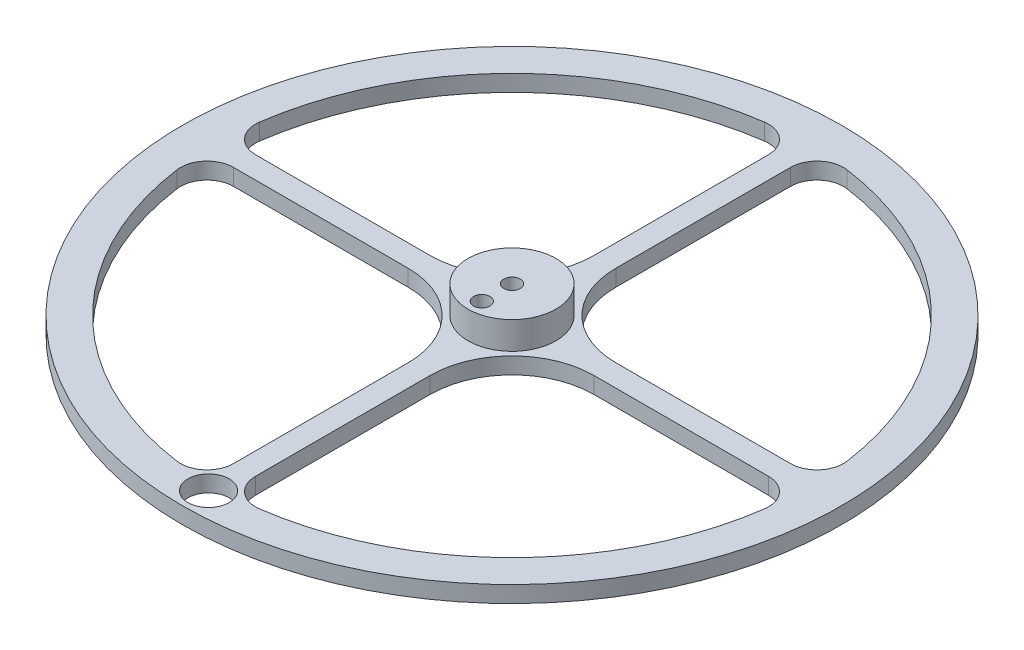
ISO-10303-21;
HEADER;
FILE_DESCRIPTION(('STEP AP214'),'2;1');
FILE_NAME('part.step','',(''),(''),'','','');
FILE_SCHEMA(('AUTOMOTIVE_DESIGN { 1 0 10303 214 1 1 1 1 }'));
ENDSEC;
DATA;
#1=APPLICATION_CONTEXT('core data for automotive mechanical design processes');
#2=APPLICATION_PROTOCOL_DEFINITION('international standard','automotive_design',2000,#1);
#3=PRODUCT_CONTEXT('',#1,'mechanical');
#4=PRODUCT('Part','Part','',(#3));
#5=PRODUCT_RELATED_PRODUCT_CATEGORY('part','',(#4));
#6=PRODUCT_DEFINITION_FORMATION('','',#4);
#7=PRODUCT_DEFINITION_CONTEXT('part definition',#1,'design');
#8=PRODUCT_DEFINITION('design','',#6,#7);
#9=PRODUCT_DEFINITION_SHAPE('','',#8);
#10=(LENGTH_UNIT() NAMED_UNIT(*) SI_UNIT(.MILLI.,.METRE.));
#11=(NAMED_UNIT(*) PLANE_ANGLE_UNIT() SI_UNIT($,.RADIAN.));
#12=(NAMED_UNIT(*) SI_UNIT($,.STERADIAN.) SOLID_ANGLE_UNIT());
#13=UNCERTAINTY_MEASURE_WITH_UNIT(LENGTH_MEASURE(1.E-05),#10,'distance_accuracy_value','');
#14=(GEOMETRIC_REPRESENTATION_CONTEXT(3) GLOBAL_UNCERTAINTY_ASSIGNED_CONTEXT((#13)) GLOBAL_UNIT_ASSIGNED_CONTEXT((#10,
#11,#12)) REPRESENTATION_CONTEXT('',''));
#15=CARTESIAN_POINT('',(0.,0.,0.));
#16=DIRECTION('',(0.,0.,1.));
#17=DIRECTION('',(1.,0.,0.));
#18=AXIS2_PLACEMENT_3D('',#15,#16,#17);
#19=CARTESIAN_POINT('',(0.,0.,0.));
#20=DIRECTION('',(0.,1.,0.));
#21=DIRECTION('',(0.,0.,1.));
#22=AXIS2_PLACEMENT_3D('',#19,#20,#21);
#23=PLANE('',#22);
#24=CARTESIAN_POINT('',(0.,0.,55.25));
#25=DIRECTION('',(0.,1.,0.));
#26=DIRECTION('',(0.,0.,1.));
#27=AXIS2_PLACEMENT_3D('',#24,#25,#26);
#28=CIRCLE('',#27,3.75);
#29=CARTESIAN_POINT('',(0.,0.,59.));
#30=VERTEX_POINT('',#29);
#31=EDGE_CURVE('E743',#30,#30,#28,.T.);
#32=ORIENTED_EDGE('',*,*,#31,.F.);
#33=EDGE_LOOP('',(#32));
#34=FACE_BOUND('',#33,.T.);
#35=CARTESIAN_POINT('',(0.,0.,0.));
#36=DIRECTION('',(0.,1.,0.));
#37=DIRECTION('',(0.,0.,1.));
#38=AXIS2_PLACEMENT_3D('',#35,#36,#37);
#39=CIRCLE('',#38,60.);
#40=CARTESIAN_POINT('',(0.,0.,60.));
#41=VERTEX_POINT('',#40);
#42=EDGE_CURVE('E240',#41,#41,#39,.T.);
#43=ORIENTED_EDGE('',*,*,#42,.T.);
#44=EDGE_LOOP('',(#43));
#45=FACE_BOUND('',#44,.T.);
#46=CARTESIAN_POINT('',(16.8994944431473,0.,16.8994944431475));
#47=DIRECTION('',(0.,1.,0.));
#48=DIRECTION('',(0.,0.,1.));
#49=AXIS2_PLACEMENT_3D('',#46,#47,#48);
#50=CIRCLE('',#49,14.8994942387478);
#51=CARTESIAN_POINT('',(16.8994944431474,0.,2.00000020439968));
#52=VERTEX_POINT('',#51);
#53=CARTESIAN_POINT('',(2.00000020439951,0.,16.8994944431475));
#54=VERTEX_POINT('',#53);
#55=EDGE_CURVE('E342',#52,#54,#50,.T.);
#56=ORIENTED_EDGE('',*,*,#55,.F.);
#57=DIRECTION('',(1.,0.,0.));
#58=VECTOR('',#57,1.);
#59=CARTESIAN_POINT('',(0.,0.,2.00000020439951));
#60=LINE('',#59,#58);
#61=CARTESIAN_POINT('',(48.6941677054723,0.,2.00000020440002));
#62=VERTEX_POINT('',#61);
#63=EDGE_CURVE('E344',#52,#62,#60,.T.);
#64=ORIENTED_EDGE('',*,*,#63,.T.);
#65=CARTESIAN_POINT('',(48.6941677054722,0.,6.82926831761021));
#66=DIRECTION('',(0.,1.,0.));
#67=DIRECTION('',(0.,0.,1.));
#68=AXIS2_PLACEMENT_3D('',#65,#66,#67);
#69=CIRCLE('',#68,4.82926811321019);
#70=CARTESIAN_POINT('',(53.4766304099276,0.,7.50000000000056));
#71=VERTEX_POINT('',#70);
#72=EDGE_CURVE('E347',#62,#71,#69,.F.);
#73=ORIENTED_EDGE('',*,*,#72,.T.);
#74=CARTESIAN_POINT('',(0.,0.,0.));
#75=DIRECTION('',(0.,1.,0.));
#76=DIRECTION('',(0.,0.,1.));
#77=AXIS2_PLACEMENT_3D('',#74,#75,#76);
#78=CIRCLE('',#77,54.);
#79=CARTESIAN_POINT('',(7.5,0.,53.4766304099277));
#80=VERTEX_POINT('',#79);
#81=EDGE_CURVE('E298',#80,#71,#78,.T.);
#82=ORIENTED_EDGE('',*,*,#81,.F.);
#83=CARTESIAN_POINT('',(6.8292683176097,0.,48.6941677054723));
#84=DIRECTION('',(0.,1.,0.));
#85=DIRECTION('',(0.,0.,1.));
#86=AXIS2_PLACEMENT_3D('',#83,#84,#85);
#87=CIRCLE('',#86,4.82926811321019);
#88=CARTESIAN_POINT('',(2.00000020439951,0.,48.6941677054723));
#89=VERTEX_POINT('',#88);
#90=EDGE_CURVE('E221',#89,#80,#87,.T.);
#91=ORIENTED_EDGE('',*,*,#90,.F.);
#92=DIRECTION('',(0.,0.,-1.));
#93=VECTOR('',#92,1.);
#94=CARTESIAN_POINT('',(2.00000020439951,0.,0.));
#95=LINE('',#94,#93);
#96=EDGE_CURVE('E246',#89,#54,#95,.T.);
#97=ORIENTED_EDGE('',*,*,#96,.T.);
#98=EDGE_LOOP('',(#56,#64,#73,#82,#91,#97));
#99=FACE_BOUND('',#98,.T.);
#100=CARTESIAN_POINT('',(53.4766304099277,0.,-7.49999999999944));
#101=VERTEX_POINT('',#100);
#102=CARTESIAN_POINT('',(7.50000000000037,0.,-53.4766304099276));
#103=VERTEX_POINT('',#102);
#104=EDGE_CURVE('E327',#101,#103,#78,.T.);
#105=ORIENTED_EDGE('',*,*,#104,.F.);
#106=CARTESIAN_POINT('',(48.6941677054724,0.,-6.82926831760919));
#107=DIRECTION('',(0.,1.,0.));
#108=DIRECTION('',(0.,0.,1.));
#109=AXIS2_PLACEMENT_3D('',#106,#107,#108);
#110=CIRCLE('',#109,4.82926811321019);
#111=CARTESIAN_POINT('',(48.6941677054723,0.,-2.000000204399));
#112=VERTEX_POINT('',#111);
#113=EDGE_CURVE('E328',#112,#101,#110,.T.);
#114=ORIENTED_EDGE('',*,*,#113,.F.);
#115=DIRECTION('',(-1.,0.,0.));
#116=VECTOR('',#115,1.);
#117=CARTESIAN_POINT('',(0.,0.,-2.00000020439951));
#118=LINE('',#117,#116);
#119=CARTESIAN_POINT('',(16.8994944431475,0.,-2.00000020439933));
#120=VERTEX_POINT('',#119);
#121=EDGE_CURVE('E330',#112,#120,#118,.T.);
#122=ORIENTED_EDGE('',*,*,#121,.T.);
#123=CARTESIAN_POINT('',(16.8994944431476,0.,-16.8994944431471));
#124=DIRECTION('',(0.,1.,0.));
#125=DIRECTION('',(0.,0.,1.));
#126=AXIS2_PLACEMENT_3D('',#123,#124,#125);
#127=CIRCLE('',#126,14.8994942387478);
#128=CARTESIAN_POINT('',(2.00000020439962,0.,-16.8994944431474));
#129=VERTEX_POINT('',#128);
#130=EDGE_CURVE('E333',#129,#120,#127,.T.);
#131=ORIENTED_EDGE('',*,*,#130,.F.);
#132=DIRECTION('',(0.,0.,-1.));
#133=VECTOR('',#132,1.);
#134=CARTESIAN_POINT('',(2.0000002043995,0.,0.));
#135=LINE('',#134,#133);
#136=CARTESIAN_POINT('',(2.00000020439984,0.,-48.6941677054723));
#137=VERTEX_POINT('',#136);
#138=EDGE_CURVE('E336',#129,#137,#135,.T.);
#139=ORIENTED_EDGE('',*,*,#138,.T.);
#140=CARTESIAN_POINT('',(6.82926831761003,0.,-48.6941677054722));
#141=DIRECTION('',(0.,1.,0.));
#142=DIRECTION('',(0.,0.,1.));
#143=AXIS2_PLACEMENT_3D('',#140,#141,#142);
#144=CIRCLE('',#143,4.82926811321019);
#145=EDGE_CURVE('E339',#137,#103,#144,.F.);
#146=ORIENTED_EDGE('',*,*,#145,.T.);
#147=EDGE_LOOP('',(#105,#114,#122,#131,#139,#146));
#148=FACE_BOUND('',#147,.T.);
#149=CARTESIAN_POINT('',(-7.49999999999963,0.,-53.4766304099277));
#150=VERTEX_POINT('',#149);
#151=CARTESIAN_POINT('',(-53.4766304099276,0.,-7.50000000000019));
#152=VERTEX_POINT('',#151);
#153=EDGE_CURVE('E299',#150,#152,#78,.T.);
#154=ORIENTED_EDGE('',*,*,#153,.F.);
#155=CARTESIAN_POINT('',(-6.82926831760936,0.,-48.6941677054723));
#156=DIRECTION('',(0.,1.,0.));
#157=DIRECTION('',(0.,0.,1.));
#158=AXIS2_PLACEMENT_3D('',#155,#156,#157);
#159=CIRCLE('',#158,4.82926811321019);
#160=CARTESIAN_POINT('',(-2.00000020439917,0.,-48.6941677054723));
#161=VERTEX_POINT('',#160);
#162=EDGE_CURVE('E313',#161,#150,#159,.T.);
#163=ORIENTED_EDGE('',*,*,#162,.F.);
#164=DIRECTION('',(0.,0.,1.));
#165=VECTOR('',#164,1.);
#166=CARTESIAN_POINT('',(-2.00000020439951,0.,0.));
#167=LINE('',#166,#165);
#168=CARTESIAN_POINT('',(-2.00000020439939,0.,-16.8994944431475));
#169=VERTEX_POINT('',#168);
#170=EDGE_CURVE('E315',#161,#169,#167,.T.);
#171=ORIENTED_EDGE('',*,*,#170,.T.);
#172=CARTESIAN_POINT('',(-16.8994944431471,0.,-16.8994944431476));
#173=DIRECTION('',(0.,1.,0.));
#174=DIRECTION('',(0.,0.,1.));
#175=AXIS2_PLACEMENT_3D('',#172,#173,#174);
#176=CIRCLE('',#175,14.8994942387478);
#177=CARTESIAN_POINT('',(-16.8994944431475,0.,-2.00000020439957));
#178=VERTEX_POINT('',#177);
#179=EDGE_CURVE('E318',#178,#169,#176,.T.);
#180=ORIENTED_EDGE('',*,*,#179,.F.);
#181=DIRECTION('',(-1.,0.,0.));
#182=VECTOR('',#181,1.);
#183=CARTESIAN_POINT('',(0.,0.,-2.00000020439951));
#184=LINE('',#183,#182);
#185=CARTESIAN_POINT('',(-48.6941677054723,0.,-2.00000020439968));
#186=VERTEX_POINT('',#185);
#187=EDGE_CURVE('E321',#178,#186,#184,.T.);
#188=ORIENTED_EDGE('',*,*,#187,.T.);
#189=CARTESIAN_POINT('',(-48.6941677054723,0.,-6.82926831760987));
#190=DIRECTION('',(0.,1.,0.));
#191=DIRECTION('',(0.,0.,1.));
#192=AXIS2_PLACEMENT_3D('',#189,#190,#191);
#193=CIRCLE('',#192,4.82926811321019);
#194=EDGE_CURVE('E324',#186,#152,#193,.F.);
#195=ORIENTED_EDGE('',*,*,#194,.T.);
#196=EDGE_LOOP('',(#154,#163,#171,#180,#188,#195));
#197=FACE_BOUND('',#196,.T.);
#198=CARTESIAN_POINT('',(-53.4766304099277,0.,7.49999999999981));
#199=VERTEX_POINT('',#198);
#200=CARTESIAN_POINT('',(-7.5,0.,53.4766304099277));
#201=VERTEX_POINT('',#200);
#202=EDGE_CURVE('E293',#199,#201,#78,.T.);
#203=ORIENTED_EDGE('',*,*,#202,.F.);
#204=CARTESIAN_POINT('',(-48.6941677054723,0.,6.82926831760953));
#205=DIRECTION('',(0.,1.,0.));
#206=DIRECTION('',(0.,0.,1.));
#207=AXIS2_PLACEMENT_3D('',#204,#205,#206);
#208=CIRCLE('',#207,4.8292681132102);
#209=CARTESIAN_POINT('',(-48.6941677054723,0.,2.00000020439934));
#210=VERTEX_POINT('',#209);
#211=EDGE_CURVE('E296',#210,#199,#208,.T.);
#212=ORIENTED_EDGE('',*,*,#211,.F.);
#213=DIRECTION('',(1.,0.,0.));
#214=VECTOR('',#213,1.);
#215=CARTESIAN_POINT('',(0.,0.,2.00000020439951));
#216=LINE('',#215,#214);
#217=CARTESIAN_POINT('',(-16.8994944431475,0.,2.00000020439945));
#218=VERTEX_POINT('',#217);
#219=EDGE_CURVE('E301',#210,#218,#216,.T.);
#220=ORIENTED_EDGE('',*,*,#219,.T.);
#221=CARTESIAN_POINT('',(-16.8994944431472,0.,16.8994944431475));
#222=DIRECTION('',(0.,1.,0.));
#223=DIRECTION('',(0.,0.,1.));
#224=AXIS2_PLACEMENT_3D('',#221,#222,#223);
#225=CIRCLE('',#224,14.8994942387477);
#226=CARTESIAN_POINT('',(-2.00000020439951,0.,16.8994944431475));
#227=VERTEX_POINT('',#226);
#228=EDGE_CURVE('E304',#227,#218,#225,.T.);
#229=ORIENTED_EDGE('',*,*,#228,.F.);
#230=DIRECTION('',(0.,0.,1.));
#231=VECTOR('',#230,1.);
#232=CARTESIAN_POINT('',(-2.00000020439951,0.,0.));
#233=LINE('',#232,#231);
#234=CARTESIAN_POINT('',(-2.00000020439951,0.,48.6941677054723));
#235=VERTEX_POINT('',#234);
#236=EDGE_CURVE('E307',#227,#235,#233,.T.);
#237=ORIENTED_EDGE('',*,*,#236,.T.);
#238=CARTESIAN_POINT('',(-6.8292683176097,0.,48.6941677054723));
#239=DIRECTION('',(0.,1.,0.));
#240=DIRECTION('',(0.,0.,1.));
#241=AXIS2_PLACEMENT_3D('',#238,#239,#240);
#242=CIRCLE('',#241,4.82926811321019);
#243=EDGE_CURVE('E310',#235,#201,#242,.F.);
#244=ORIENTED_EDGE('',*,*,#243,.T.);
#245=EDGE_LOOP('',(#203,#212,#220,#229,#237,#244));
#246=FACE_BOUND('',#245,.T.);
#247=CARTESIAN_POINT('',(0.,0.,0.));
#248=DIRECTION('',(0.,1.,0.));
#249=DIRECTION('',(0.,0.,1.));
#250=AXIS2_PLACEMENT_3D('',#247,#248,#249);
#251=CIRCLE('',#250,8.);
#252=CARTESIAN_POINT('',(0.,0.,8.));
#253=VERTEX_POINT('',#252);
#254=EDGE_CURVE('E760',#253,#253,#251,.T.);
#255=ORIENTED_EDGE('',*,*,#254,.F.);
#256=EDGE_LOOP('',(#255));
#257=FACE_BOUND('',#256,.T.);
#258=ADVANCED_FACE('F39',(#34,#45,#99,#148,#197,#246,#257),#23,.T.);
#259=CARTESIAN_POINT('',(16.8994944431473,-3.,16.8994944431475));
#260=DIRECTION('',(0.,1.,0.));
#261=DIRECTION('',(0.,0.,1.));
#262=AXIS2_PLACEMENT_3D('',#259,#260,#261);
#263=CYLINDRICAL_SURFACE('',#262,14.8994942387478);
#264=ORIENTED_EDGE('',*,*,#55,.T.);
#265=DIRECTION('',(0.,1.,0.));
#266=VECTOR('',#265,1.);
#267=CARTESIAN_POINT('',(2.00000020439951,-3.,16.8994944431475));
#268=LINE('',#267,#266);
#269=CARTESIAN_POINT('',(2.00000020439951,-3.,16.8994944431475));
#270=VERTEX_POINT('',#269);
#271=EDGE_CURVE('E11',#270,#54,#268,.T.);
#272=ORIENTED_EDGE('',*,*,#271,.F.);
#273=CARTESIAN_POINT('',(16.8994944431473,-3.,16.8994944431475));
#274=DIRECTION('',(0.,1.,0.));
#275=DIRECTION('',(0.,0.,1.));
#276=AXIS2_PLACEMENT_3D('',#273,#274,#275);
#277=CIRCLE('',#276,14.8994942387478);
#278=CARTESIAN_POINT('',(16.8994944431474,-3.,2.00000020439968));
#279=VERTEX_POINT('',#278);
#280=EDGE_CURVE('E58',#279,#270,#277,.T.);
#281=ORIENTED_EDGE('',*,*,#280,.F.);
#282=DIRECTION('',(0.,1.,0.));
#283=VECTOR('',#282,1.);
#284=CARTESIAN_POINT('',(16.8994944431474,-3.,2.00000020439968));
#285=LINE('',#284,#283);
#286=EDGE_CURVE('E357',#279,#52,#285,.T.);
#287=ORIENTED_EDGE('',*,*,#286,.T.);
#288=EDGE_LOOP('',(#264,#272,#281,#287));
#289=FACE_BOUND('',#288,.T.);
#290=ADVANCED_FACE('F456',(#289),#263,.F.);
#291=CARTESIAN_POINT('',(2.00000020439951,-3.,0.));
#292=DIRECTION('',(1.,0.,0.));
#293=DIRECTION('',(0.,0.,-1.));
#294=AXIS2_PLACEMENT_3D('',#291,#292,#293);
#295=PLANE('',#294);
#296=ORIENTED_EDGE('',*,*,#96,.F.);
#297=DIRECTION('',(0.,1.,0.));
#298=VECTOR('',#297,1.);
#299=CARTESIAN_POINT('',(2.00000020439951,-3.,48.6941677054723));
#300=LINE('',#299,#298);
#301=CARTESIAN_POINT('',(2.00000020439951,-3.,48.6941677054723));
#302=VERTEX_POINT('',#301);
#303=EDGE_CURVE('E49',#302,#89,#300,.T.);
#304=ORIENTED_EDGE('',*,*,#303,.F.);
#305=DIRECTION('',(0.,0.,-1.));
#306=VECTOR('',#305,1.);
#307=CARTESIAN_POINT('',(2.00000020439951,-3.,0.));
#308=LINE('',#307,#306);
#309=EDGE_CURVE('E216',#302,#270,#308,.T.);
#310=ORIENTED_EDGE('',*,*,#309,.T.);
#311=ORIENTED_EDGE('',*,*,#271,.T.);
#312=EDGE_LOOP('',(#296,#304,#310,#311));
#313=FACE_BOUND('',#312,.T.);
#314=ADVANCED_FACE('F457',(#313),#295,.T.);
#315=CARTESIAN_POINT('',(6.8292683176097,-3.,48.6941677054723));
#316=DIRECTION('',(0.,1.,0.));
#317=DIRECTION('',(0.,0.,1.));
#318=AXIS2_PLACEMENT_3D('',#315,#316,#317);
#319=CYLINDRICAL_SURFACE('',#318,4.82926811321019);
#320=ORIENTED_EDGE('',*,*,#90,.T.);
#321=DIRECTION('',(0.,1.,0.));
#322=VECTOR('',#321,1.);
#323=CARTESIAN_POINT('',(7.5,-3.,53.4766304099277));
#324=LINE('',#323,#322);
#325=CARTESIAN_POINT('',(7.5,-3.,53.4766304099277));
#326=VERTEX_POINT('',#325);
#327=EDGE_CURVE('E219',#326,#80,#324,.T.);
#328=ORIENTED_EDGE('',*,*,#327,.F.);
#329=CARTESIAN_POINT('',(6.8292683176097,-3.,48.6941677054723));
#330=DIRECTION('',(0.,1.,0.));
#331=DIRECTION('',(0.,0.,1.));
#332=AXIS2_PLACEMENT_3D('',#329,#330,#331);
#333=CIRCLE('',#332,4.82926811321019);
#334=EDGE_CURVE('E208',#302,#326,#333,.T.);
#335=ORIENTED_EDGE('',*,*,#334,.F.);
#336=ORIENTED_EDGE('',*,*,#303,.T.);
#337=EDGE_LOOP('',(#320,#328,#335,#336));
#338=FACE_BOUND('',#337,.T.);
#339=ADVANCED_FACE('F220',(#338),#319,.F.);
#340=CARTESIAN_POINT('',(0.,-3.,0.));
#341=DIRECTION('',(0.,1.,0.));
#342=DIRECTION('',(0.,0.,1.));
#343=AXIS2_PLACEMENT_3D('',#340,#341,#342);
#344=CYLINDRICAL_SURFACE('',#343,54.);
#345=ORIENTED_EDGE('',*,*,#81,.T.);
#346=DIRECTION('',(0.,1.,0.));
#347=VECTOR('',#346,1.);
#348=CARTESIAN_POINT('',(53.4766304099276,-3.,7.50000000000056));
#349=LINE('',#348,#347);
#350=CARTESIAN_POINT('',(53.4766304099276,-3.,7.50000000000056));
#351=VERTEX_POINT('',#350);
#352=EDGE_CURVE('E225',#351,#71,#349,.T.);
#353=ORIENTED_EDGE('',*,*,#352,.F.);
#354=CARTESIAN_POINT('',(0.,-3.,0.));
#355=DIRECTION('',(0.,1.,0.));
#356=DIRECTION('',(0.,0.,1.));
#357=AXIS2_PLACEMENT_3D('',#354,#355,#356);
#358=CIRCLE('',#357,54.);
#359=EDGE_CURVE('E214',#326,#351,#358,.T.);
#360=ORIENTED_EDGE('',*,*,#359,.F.);
#361=ORIENTED_EDGE('',*,*,#327,.T.);
#362=EDGE_LOOP('',(#345,#353,#360,#361));
#363=FACE_BOUND('',#362,.T.);
#364=ADVANCED_FACE('F227',(#363),#344,.F.);
#365=CARTESIAN_POINT('',(48.6941677054722,-3.,6.82926831761021));
#366=DIRECTION('',(0.,1.,0.));
#367=DIRECTION('',(0.,0.,1.));
#368=AXIS2_PLACEMENT_3D('',#365,#366,#367);
#369=CYLINDRICAL_SURFACE('',#368,4.82926811321019);
#370=ORIENTED_EDGE('',*,*,#72,.F.);
#371=DIRECTION('',(0.,1.,0.));
#372=VECTOR('',#371,1.);
#373=CARTESIAN_POINT('',(48.6941677054723,-3.,2.00000020440002));
#374=LINE('',#373,#372);
#375=CARTESIAN_POINT('',(48.6941677054723,-3.,2.00000020440002));
#376=VERTEX_POINT('',#375);
#377=EDGE_CURVE('E355',#376,#62,#374,.T.);
#378=ORIENTED_EDGE('',*,*,#377,.F.);
#379=CARTESIAN_POINT('',(48.6941677054722,-3.,6.82926831761021));
#380=DIRECTION('',(0.,1.,0.));
#381=DIRECTION('',(0.,0.,1.));
#382=AXIS2_PLACEMENT_3D('',#379,#380,#381);
#383=CIRCLE('',#382,4.82926811321019);
#384=EDGE_CURVE('E229',#376,#351,#383,.F.);
#385=ORIENTED_EDGE('',*,*,#384,.T.);
#386=ORIENTED_EDGE('',*,*,#352,.T.);
#387=EDGE_LOOP('',(#370,#378,#385,#386));
#388=FACE_BOUND('',#387,.T.);
#389=ADVANCED_FACE('F452',(#388),#369,.F.);
#390=ORIENTED_EDGE('',*,*,#104,.T.);
#391=DIRECTION('',(0.,1.,0.));
#392=VECTOR('',#391,1.);
#393=CARTESIAN_POINT('',(7.50000000000037,-3.,-53.4766304099276));
#394=LINE('',#393,#392);
#395=CARTESIAN_POINT('',(7.50000000000037,-3.,-53.4766304099276));
#396=VERTEX_POINT('',#395);
#397=EDGE_CURVE('E359',#396,#103,#394,.T.);
#398=ORIENTED_EDGE('',*,*,#397,.F.);
#399=CARTESIAN_POINT('',(53.4766304099277,-3.,-7.49999999999944));
#400=VERTEX_POINT('',#399);
#401=EDGE_CURVE('E231',#400,#396,#358,.T.);
#402=ORIENTED_EDGE('',*,*,#401,.F.);
#403=DIRECTION('',(0.,1.,0.));
#404=VECTOR('',#403,1.);
#405=CARTESIAN_POINT('',(53.4766304099277,-3.,-7.49999999999944));
#406=LINE('',#405,#404);
#407=EDGE_CURVE('E369',#400,#101,#406,.T.);
#408=ORIENTED_EDGE('',*,*,#407,.T.);
#409=EDGE_LOOP('',(#390,#398,#402,#408));
#410=FACE_BOUND('',#409,.T.);
#411=ADVANCED_FACE('F425',(#410),#344,.F.);
#412=CARTESIAN_POINT('',(6.82926831761003,-3.,-48.6941677054722));
#413=DIRECTION('',(0.,1.,0.));
#414=DIRECTION('',(0.,0.,1.));
#415=AXIS2_PLACEMENT_3D('',#412,#413,#414);
#416=CYLINDRICAL_SURFACE('',#415,4.82926811321019);
#417=ORIENTED_EDGE('',*,*,#145,.F.);
#418=DIRECTION('',(0.,1.,0.));
#419=VECTOR('',#418,1.);
#420=CARTESIAN_POINT('',(2.00000020439984,-3.,-48.6941677054723));
#421=LINE('',#420,#419);
#422=CARTESIAN_POINT('',(2.00000020439984,-3.,-48.6941677054723));
#423=VERTEX_POINT('',#422);
#424=EDGE_CURVE('E361',#423,#137,#421,.T.);
#425=ORIENTED_EDGE('',*,*,#424,.F.);
#426=CARTESIAN_POINT('',(6.82926831761003,-3.,-48.6941677054722));
#427=DIRECTION('',(0.,1.,0.));
#428=DIRECTION('',(0.,0.,1.));
#429=AXIS2_PLACEMENT_3D('',#426,#427,#428);
#430=CIRCLE('',#429,4.82926811321019);
#431=EDGE_CURVE('E283',#423,#396,#430,.F.);
#432=ORIENTED_EDGE('',*,*,#431,.T.);
#433=ORIENTED_EDGE('',*,*,#397,.T.);
#434=EDGE_LOOP('',(#417,#425,#432,#433));
#435=FACE_BOUND('',#434,.T.);
#436=ADVANCED_FACE('F429',(#435),#416,.F.);
#437=CARTESIAN_POINT('',(2.0000002043995,-3.,0.));
#438=DIRECTION('',(1.,0.,0.));
#439=DIRECTION('',(0.,0.,-1.));
#440=AXIS2_PLACEMENT_3D('',#437,#438,#439);
#441=PLANE('',#440);
#442=ORIENTED_EDGE('',*,*,#138,.F.);
#443=DIRECTION('',(0.,1.,0.));
#444=VECTOR('',#443,1.);
#445=CARTESIAN_POINT('',(2.00000020439962,-3.,-16.8994944431474));
#446=LINE('',#445,#444);
#447=CARTESIAN_POINT('',(2.00000020439962,-3.,-16.8994944431474));
#448=VERTEX_POINT('',#447);
#449=EDGE_CURVE('E363',#448,#129,#446,.T.);
#450=ORIENTED_EDGE('',*,*,#449,.F.);
#451=DIRECTION('',(0.,0.,-1.));
#452=VECTOR('',#451,1.);
#453=CARTESIAN_POINT('',(2.0000002043995,-3.,0.));
#454=LINE('',#453,#452);
#455=EDGE_CURVE('E280',#448,#423,#454,.T.);
#456=ORIENTED_EDGE('',*,*,#455,.T.);
#457=ORIENTED_EDGE('',*,*,#424,.T.);
#458=EDGE_LOOP('',(#442,#450,#456,#457));
#459=FACE_BOUND('',#458,.T.);
#460=ADVANCED_FACE('F432',(#459),#441,.T.);
#461=CARTESIAN_POINT('',(16.8994944431476,-3.,-16.8994944431471));
#462=DIRECTION('',(0.,1.,0.));
#463=DIRECTION('',(0.,0.,1.));
#464=AXIS2_PLACEMENT_3D('',#461,#462,#463);
#465=CYLINDRICAL_SURFACE('',#464,14.8994942387478);
#466=ORIENTED_EDGE('',*,*,#130,.T.);
#467=DIRECTION('',(0.,1.,0.));
#468=VECTOR('',#467,1.);
#469=CARTESIAN_POINT('',(16.8994944431475,-3.,-2.00000020439933));
#470=LINE('',#469,#468);
#471=CARTESIAN_POINT('',(16.8994944431475,-3.,-2.00000020439933));
#472=VERTEX_POINT('',#471);
#473=EDGE_CURVE('E365',#472,#120,#470,.T.);
#474=ORIENTED_EDGE('',*,*,#473,.F.);
#475=CARTESIAN_POINT('',(16.8994944431476,-3.,-16.8994944431471));
#476=DIRECTION('',(0.,1.,0.));
#477=DIRECTION('',(0.,0.,1.));
#478=AXIS2_PLACEMENT_3D('',#475,#476,#477);
#479=CIRCLE('',#478,14.8994942387478);
#480=EDGE_CURVE('E278',#448,#472,#479,.T.);
#481=ORIENTED_EDGE('',*,*,#480,.F.);
#482=ORIENTED_EDGE('',*,*,#449,.T.);
#483=EDGE_LOOP('',(#466,#474,#481,#482));
#484=FACE_BOUND('',#483,.T.);
#485=ADVANCED_FACE('F436',(#484),#465,.F.);
#486=CARTESIAN_POINT('',(0.,-3.,-2.00000020439951));
#487=DIRECTION('',(0.,0.,-1.));
#488=DIRECTION('',(-1.,0.,0.));
#489=AXIS2_PLACEMENT_3D('',#486,#487,#488);
#490=PLANE('',#489);
#491=ORIENTED_EDGE('',*,*,#121,.F.);
#492=DIRECTION('',(0.,1.,0.));
#493=VECTOR('',#492,1.);
#494=CARTESIAN_POINT('',(48.6941677054723,-3.,-2.000000204399));
#495=LINE('',#494,#493);
#496=CARTESIAN_POINT('',(48.6941677054723,-3.,-2.000000204399));
#497=VERTEX_POINT('',#496);
#498=EDGE_CURVE('E367',#497,#112,#495,.T.);
#499=ORIENTED_EDGE('',*,*,#498,.F.);
#500=DIRECTION('',(-1.,0.,0.));
#501=VECTOR('',#500,1.);
#502=CARTESIAN_POINT('',(0.,-3.,-2.00000020439951));
#503=LINE('',#502,#501);
#504=EDGE_CURVE('E275',#497,#472,#503,.T.);
#505=ORIENTED_EDGE('',*,*,#504,.T.);
#506=ORIENTED_EDGE('',*,*,#473,.T.);
#507=EDGE_LOOP('',(#491,#499,#505,#506));
#508=FACE_BOUND('',#507,.T.);
#509=ADVANCED_FACE('F440',(#508),#490,.T.);
#510=ORIENTED_EDGE('',*,*,#153,.T.);
#511=DIRECTION('',(0.,1.,0.));
#512=VECTOR('',#511,1.);
#513=CARTESIAN_POINT('',(-53.4766304099276,-3.,-7.50000000000019));
#514=LINE('',#513,#512);
#515=CARTESIAN_POINT('',(-53.4766304099276,-3.,-7.50000000000019));
#516=VERTEX_POINT('',#515);
#517=EDGE_CURVE('E372',#516,#152,#514,.T.);
#518=ORIENTED_EDGE('',*,*,#517,.F.);
#519=CARTESIAN_POINT('',(-7.49999999999963,-3.,-53.4766304099277));
#520=VERTEX_POINT('',#519);
#521=EDGE_CURVE('E239',#520,#516,#358,.T.);
#522=ORIENTED_EDGE('',*,*,#521,.F.);
#523=DIRECTION('',(0.,1.,0.));
#524=VECTOR('',#523,1.);
#525=CARTESIAN_POINT('',(-7.49999999999963,-3.,-53.4766304099277));
#526=LINE('',#525,#524);
#527=EDGE_CURVE('E382',#520,#150,#526,.T.);
#528=ORIENTED_EDGE('',*,*,#527,.T.);
#529=EDGE_LOOP('',(#510,#518,#522,#528));
#530=FACE_BOUND('',#529,.T.);
#531=ADVANCED_FACE('F526',(#530),#344,.F.);
#532=CARTESIAN_POINT('',(-48.6941677054723,-3.,-6.82926831760987));
#533=DIRECTION('',(0.,1.,0.));
#534=DIRECTION('',(0.,0.,1.));
#535=AXIS2_PLACEMENT_3D('',#532,#533,#534);
#536=CYLINDRICAL_SURFACE('',#535,4.82926811321019);
#537=ORIENTED_EDGE('',*,*,#194,.F.);
#538=DIRECTION('',(0.,1.,0.));
#539=VECTOR('',#538,1.);
#540=CARTESIAN_POINT('',(-48.6941677054723,-3.,-2.00000020439968));
#541=LINE('',#540,#539);
#542=CARTESIAN_POINT('',(-48.6941677054723,-3.,-2.00000020439968));
#543=VERTEX_POINT('',#542);
#544=EDGE_CURVE('E374',#543,#186,#541,.T.);
#545=ORIENTED_EDGE('',*,*,#544,.F.);
#546=CARTESIAN_POINT('',(-48.6941677054723,-3.,-6.82926831760987));
#547=DIRECTION('',(0.,1.,0.));
#548=DIRECTION('',(0.,0.,1.));
#549=AXIS2_PLACEMENT_3D('',#546,#547,#548);
#550=CIRCLE('',#549,4.82926811321019);
#551=EDGE_CURVE('E238',#543,#516,#550,.F.);
#552=ORIENTED_EDGE('',*,*,#551,.T.);
#553=ORIENTED_EDGE('',*,*,#517,.T.);
#554=EDGE_LOOP('',(#537,#545,#552,#553));
#555=FACE_BOUND('',#554,.T.);
#556=ADVANCED_FACE('F528',(#555),#536,.F.);
#557=CARTESIAN_POINT('',(0.,-3.,-2.00000020439951));
#558=DIRECTION('',(0.,0.,-1.));
#559=DIRECTION('',(-1.,0.,0.));
#560=AXIS2_PLACEMENT_3D('',#557,#558,#559);
#561=PLANE('',#560);
#562=ORIENTED_EDGE('',*,*,#187,.F.);
#563=DIRECTION('',(0.,1.,0.));
#564=VECTOR('',#563,1.);
#565=CARTESIAN_POINT('',(-16.8994944431475,-3.,-2.00000020439957));
#566=LINE('',#565,#564);
#567=CARTESIAN_POINT('',(-16.8994944431475,-3.,-2.00000020439957));
#568=VERTEX_POINT('',#567);
#569=EDGE_CURVE('E376',#568,#178,#566,.T.);
#570=ORIENTED_EDGE('',*,*,#569,.F.);
#571=DIRECTION('',(-1.,0.,0.));
#572=VECTOR('',#571,1.);
#573=CARTESIAN_POINT('',(0.,-3.,-2.00000020439951));
#574=LINE('',#573,#572);
#575=EDGE_CURVE('E269',#568,#543,#574,.T.);
#576=ORIENTED_EDGE('',*,*,#575,.T.);
#577=ORIENTED_EDGE('',*,*,#544,.T.);
#578=EDGE_LOOP('',(#562,#570,#576,#577));
#579=FACE_BOUND('',#578,.T.);
#580=ADVANCED_FACE('F531',(#579),#561,.T.);
#581=CARTESIAN_POINT('',(-16.8994944431471,-3.,-16.8994944431476));
#582=DIRECTION('',(0.,1.,0.));
#583=DIRECTION('',(0.,0.,1.));
#584=AXIS2_PLACEMENT_3D('',#581,#582,#583);
#585=CYLINDRICAL_SURFACE('',#584,14.8994942387478);
#586=ORIENTED_EDGE('',*,*,#179,.T.);
#587=DIRECTION('',(0.,1.,0.));
#588=VECTOR('',#587,1.);
#589=CARTESIAN_POINT('',(-2.00000020439939,-3.,-16.8994944431475));
#590=LINE('',#589,#588);
#591=CARTESIAN_POINT('',(-2.00000020439939,-3.,-16.8994944431475));
#592=VERTEX_POINT('',#591);
#593=EDGE_CURVE('E378',#592,#169,#590,.T.);
#594=ORIENTED_EDGE('',*,*,#593,.F.);
#595=CARTESIAN_POINT('',(-16.8994944431471,-3.,-16.8994944431476));
#596=DIRECTION('',(0.,1.,0.));
#597=DIRECTION('',(0.,0.,1.));
#598=AXIS2_PLACEMENT_3D('',#595,#596,#597);
#599=CIRCLE('',#598,14.8994942387478);
#600=EDGE_CURVE('E267',#568,#592,#599,.T.);
#601=ORIENTED_EDGE('',*,*,#600,.F.);
#602=ORIENTED_EDGE('',*,*,#569,.T.);
#603=EDGE_LOOP('',(#586,#594,#601,#602));
#604=FACE_BOUND('',#603,.T.);
#605=ADVANCED_FACE('F534',(#604),#585,.F.);
#606=CARTESIAN_POINT('',(-2.00000020439951,-3.,0.));
#607=DIRECTION('',(-1.,0.,0.));
#608=DIRECTION('',(0.,0.,1.));
#609=AXIS2_PLACEMENT_3D('',#606,#607,#608);
#610=PLANE('',#609);
#611=ORIENTED_EDGE('',*,*,#170,.F.);
#612=DIRECTION('',(0.,1.,0.));
#613=VECTOR('',#612,1.);
#614=CARTESIAN_POINT('',(-2.00000020439917,-3.,-48.6941677054723));
#615=LINE('',#614,#613);
#616=CARTESIAN_POINT('',(-2.00000020439917,-3.,-48.6941677054723));
#617=VERTEX_POINT('',#616);
#618=EDGE_CURVE('E380',#617,#161,#615,.T.);
#619=ORIENTED_EDGE('',*,*,#618,.F.);
#620=DIRECTION('',(0.,0.,1.));
#621=VECTOR('',#620,1.);
#622=CARTESIAN_POINT('',(-2.00000020439951,-3.,0.));
#623=LINE('',#622,#621);
#624=EDGE_CURVE('E254',#617,#592,#623,.T.);
#625=ORIENTED_EDGE('',*,*,#624,.T.);
#626=ORIENTED_EDGE('',*,*,#593,.T.);
#627=EDGE_LOOP('',(#611,#619,#625,#626));
#628=FACE_BOUND('',#627,.T.);
#629=ADVANCED_FACE('F495',(#628),#610,.T.);
#630=ORIENTED_EDGE('',*,*,#202,.T.);
#631=DIRECTION('',(0.,1.,0.));
#632=VECTOR('',#631,1.);
#633=CARTESIAN_POINT('',(-7.5,-3.,53.4766304099277));
#634=LINE('',#633,#632);
#635=CARTESIAN_POINT('',(-7.5,-3.,53.4766304099277));
#636=VERTEX_POINT('',#635);
#637=EDGE_CURVE('E385',#636,#201,#634,.T.);
#638=ORIENTED_EDGE('',*,*,#637,.F.);
#639=CARTESIAN_POINT('',(-53.4766304099277,-3.,7.49999999999981));
#640=VERTEX_POINT('',#639);
#641=EDGE_CURVE('E232',#640,#636,#358,.T.);
#642=ORIENTED_EDGE('',*,*,#641,.F.);
#643=DIRECTION('',(0.,1.,0.));
#644=VECTOR('',#643,1.);
#645=CARTESIAN_POINT('',(-53.4766304099277,-3.,7.49999999999981));
#646=LINE('',#645,#644);
#647=EDGE_CURVE('E43',#640,#199,#646,.T.);
#648=ORIENTED_EDGE('',*,*,#647,.T.);
#649=EDGE_LOOP('',(#630,#638,#642,#648));
#650=FACE_BOUND('',#649,.T.);
#651=ADVANCED_FACE('F398',(#650),#344,.F.);
#652=CARTESIAN_POINT('',(-6.8292683176097,-3.,48.6941677054723));
#653=DIRECTION('',(0.,1.,0.));
#654=DIRECTION('',(0.,0.,1.));
#655=AXIS2_PLACEMENT_3D('',#652,#653,#654);
#656=CYLINDRICAL_SURFACE('',#655,4.82926811321019);
#657=ORIENTED_EDGE('',*,*,#243,.F.);
#658=DIRECTION('',(0.,1.,0.));
#659=VECTOR('',#658,1.);
#660=CARTESIAN_POINT('',(-2.00000020439951,-3.,48.6941677054723));
#661=LINE('',#660,#659);
#662=CARTESIAN_POINT('',(-2.00000020439951,-3.,48.6941677054723));
#663=VERTEX_POINT('',#662);
#664=EDGE_CURVE('E387',#663,#235,#661,.T.);
#665=ORIENTED_EDGE('',*,*,#664,.F.);
#666=CARTESIAN_POINT('',(-6.8292683176097,-3.,48.6941677054723));
#667=DIRECTION('',(0.,1.,0.));
#668=DIRECTION('',(0.,0.,1.));
#669=AXIS2_PLACEMENT_3D('',#666,#667,#668);
#670=CIRCLE('',#669,4.82926811321019);
#671=EDGE_CURVE('E249',#663,#636,#670,.F.);
#672=ORIENTED_EDGE('',*,*,#671,.T.);
#673=ORIENTED_EDGE('',*,*,#637,.T.);
#674=EDGE_LOOP('',(#657,#665,#672,#673));
#675=FACE_BOUND('',#674,.T.);
#676=ADVANCED_FACE('F405',(#675),#656,.F.);
#677=CARTESIAN_POINT('',(-2.00000020439951,-3.,0.));
#678=DIRECTION('',(-1.,0.,0.));
#679=DIRECTION('',(0.,0.,1.));
#680=AXIS2_PLACEMENT_3D('',#677,#678,#679);
#681=PLANE('',#680);
#682=ORIENTED_EDGE('',*,*,#236,.F.);
#683=DIRECTION('',(0.,1.,0.));
#684=VECTOR('',#683,1.);
#685=CARTESIAN_POINT('',(-2.00000020439951,-3.,16.8994944431475));
#686=LINE('',#685,#684);
#687=CARTESIAN_POINT('',(-2.00000020439951,-3.,16.8994944431475));
#688=VERTEX_POINT('',#687);
#689=EDGE_CURVE('E389',#688,#227,#686,.T.);
#690=ORIENTED_EDGE('',*,*,#689,.F.);
#691=DIRECTION('',(0.,0.,1.));
#692=VECTOR('',#691,1.);
#693=CARTESIAN_POINT('',(-2.00000020439951,-3.,0.));
#694=LINE('',#693,#692);
#695=EDGE_CURVE('E257',#688,#663,#694,.T.);
#696=ORIENTED_EDGE('',*,*,#695,.T.);
#697=ORIENTED_EDGE('',*,*,#664,.T.);
#698=EDGE_LOOP('',(#682,#690,#696,#697));
#699=FACE_BOUND('',#698,.T.);
#700=ADVANCED_FACE('F408',(#699),#681,.T.);
#701=CARTESIAN_POINT('',(-16.8994944431472,-3.,16.8994944431475));
#702=DIRECTION('',(0.,1.,0.));
#703=DIRECTION('',(0.,0.,1.));
#704=AXIS2_PLACEMENT_3D('',#701,#702,#703);
#705=CYLINDRICAL_SURFACE('',#704,14.8994942387477);
#706=ORIENTED_EDGE('',*,*,#228,.T.);
#707=DIRECTION('',(0.,1.,0.));
#708=VECTOR('',#707,1.);
#709=CARTESIAN_POINT('',(-16.8994944431475,-3.,2.00000020439945));
#710=LINE('',#709,#708);
#711=CARTESIAN_POINT('',(-16.8994944431475,-3.,2.00000020439945));
#712=VERTEX_POINT('',#711);
#713=EDGE_CURVE('E391',#712,#218,#710,.T.);
#714=ORIENTED_EDGE('',*,*,#713,.F.);
#715=CARTESIAN_POINT('',(-16.8994944431472,-3.,16.8994944431475));
#716=DIRECTION('',(0.,1.,0.));
#717=DIRECTION('',(0.,0.,1.));
#718=AXIS2_PLACEMENT_3D('',#715,#716,#717);
#719=CIRCLE('',#718,14.8994942387477);
#720=EDGE_CURVE('E261',#688,#712,#719,.T.);
#721=ORIENTED_EDGE('',*,*,#720,.F.);
#722=ORIENTED_EDGE('',*,*,#689,.T.);
#723=EDGE_LOOP('',(#706,#714,#721,#722));
#724=FACE_BOUND('',#723,.T.);
#725=ADVANCED_FACE('F501',(#724),#705,.F.);
#726=CARTESIAN_POINT('',(0.,-3.,2.00000020439951));
#727=DIRECTION('',(0.,0.,1.));
#728=DIRECTION('',(1.,0.,0.));
#729=AXIS2_PLACEMENT_3D('',#726,#727,#728);
#730=PLANE('',#729);
#731=ORIENTED_EDGE('',*,*,#219,.F.);
#732=DIRECTION('',(0.,1.,0.));
#733=VECTOR('',#732,1.);
#734=CARTESIAN_POINT('',(-48.6941677054723,-3.,2.00000020439934));
#735=LINE('',#734,#733);
#736=CARTESIAN_POINT('',(-48.6941677054723,-3.,2.00000020439934));
#737=VERTEX_POINT('',#736);
#738=EDGE_CURVE('E392',#737,#210,#735,.T.);
#739=ORIENTED_EDGE('',*,*,#738,.F.);
#740=DIRECTION('',(1.,0.,0.));
#741=VECTOR('',#740,1.);
#742=CARTESIAN_POINT('',(0.,-3.,2.00000020439951));
#743=LINE('',#742,#741);
#744=EDGE_CURVE('E244',#737,#712,#743,.T.);
#745=ORIENTED_EDGE('',*,*,#744,.T.);
#746=ORIENTED_EDGE('',*,*,#713,.T.);
#747=EDGE_LOOP('',(#731,#739,#745,#746));
#748=FACE_BOUND('',#747,.T.);
#749=ADVANCED_FACE('F503',(#748),#730,.T.);
#750=CARTESIAN_POINT('',(0.,-3.,2.00000020439951));
#751=DIRECTION('',(0.,0.,1.));
#752=DIRECTION('',(1.,0.,0.));
#753=AXIS2_PLACEMENT_3D('',#750,#751,#752);
#754=PLANE('',#753);
#755=ORIENTED_EDGE('',*,*,#63,.F.);
#756=ORIENTED_EDGE('',*,*,#286,.F.);
#757=DIRECTION('',(1.,0.,0.));
#758=VECTOR('',#757,1.);
#759=CARTESIAN_POINT('',(0.,-3.,2.00000020439951));
#760=LINE('',#759,#758);
#761=EDGE_CURVE('E233',#279,#376,#760,.T.);
#762=ORIENTED_EDGE('',*,*,#761,.T.);
#763=ORIENTED_EDGE('',*,*,#377,.T.);
#764=EDGE_LOOP('',(#755,#756,#762,#763));
#765=FACE_BOUND('',#764,.T.);
#766=ADVANCED_FACE('F454',(#765),#754,.T.);
#767=CARTESIAN_POINT('',(48.6941677054724,-3.,-6.82926831760919));
#768=DIRECTION('',(0.,1.,0.));
#769=DIRECTION('',(0.,0.,1.));
#770=AXIS2_PLACEMENT_3D('',#767,#768,#769);
#771=CYLINDRICAL_SURFACE('',#770,4.82926811321019);
#772=ORIENTED_EDGE('',*,*,#113,.T.);
#773=ORIENTED_EDGE('',*,*,#407,.F.);
#774=CARTESIAN_POINT('',(48.6941677054724,-3.,-6.82926831760919));
#775=DIRECTION('',(0.,1.,0.));
#776=DIRECTION('',(0.,0.,1.));
#777=AXIS2_PLACEMENT_3D('',#774,#775,#776);
#778=CIRCLE('',#777,4.82926811321019);
#779=EDGE_CURVE('E237',#497,#400,#778,.T.);
#780=ORIENTED_EDGE('',*,*,#779,.F.);
#781=ORIENTED_EDGE('',*,*,#498,.T.);
#782=EDGE_LOOP('',(#772,#773,#780,#781));
#783=FACE_BOUND('',#782,.T.);
#784=ADVANCED_FACE('F443',(#783),#771,.F.);
#785=CARTESIAN_POINT('',(-6.82926831760936,-3.,-48.6941677054723));
#786=DIRECTION('',(0.,1.,0.));
#787=DIRECTION('',(0.,0.,1.));
#788=AXIS2_PLACEMENT_3D('',#785,#786,#787);
#789=CYLINDRICAL_SURFACE('',#788,4.82926811321019);
#790=ORIENTED_EDGE('',*,*,#162,.T.);
#791=ORIENTED_EDGE('',*,*,#527,.F.);
#792=CARTESIAN_POINT('',(-6.82926831760936,-3.,-48.6941677054723));
#793=DIRECTION('',(0.,1.,0.));
#794=DIRECTION('',(0.,0.,1.));
#795=AXIS2_PLACEMENT_3D('',#792,#793,#794);
#796=CIRCLE('',#795,4.82926811321019);
#797=EDGE_CURVE('E248',#617,#520,#796,.T.);
#798=ORIENTED_EDGE('',*,*,#797,.F.);
#799=ORIENTED_EDGE('',*,*,#618,.T.);
#800=EDGE_LOOP('',(#790,#791,#798,#799));
#801=FACE_BOUND('',#800,.T.);
#802=ADVANCED_FACE('F480',(#801),#789,.F.);
#803=CARTESIAN_POINT('',(-48.6941677054723,-3.,6.82926831760953));
#804=DIRECTION('',(0.,1.,0.));
#805=DIRECTION('',(0.,0.,1.));
#806=AXIS2_PLACEMENT_3D('',#803,#804,#805);
#807=CYLINDRICAL_SURFACE('',#806,4.8292681132102);
#808=ORIENTED_EDGE('',*,*,#211,.T.);
#809=ORIENTED_EDGE('',*,*,#647,.F.);
#810=CARTESIAN_POINT('',(-48.6941677054723,-3.,6.82926831760953));
#811=DIRECTION('',(0.,1.,0.));
#812=DIRECTION('',(0.,0.,1.));
#813=AXIS2_PLACEMENT_3D('',#810,#811,#812);
#814=CIRCLE('',#813,4.8292681132102);
#815=EDGE_CURVE('E147',#737,#640,#814,.T.);
#816=ORIENTED_EDGE('',*,*,#815,.F.);
#817=ORIENTED_EDGE('',*,*,#738,.T.);
#818=EDGE_LOOP('',(#808,#809,#816,#817));
#819=FACE_BOUND('',#818,.T.);
#820=ADVANCED_FACE('F41',(#819),#807,.F.);
#821=CARTESIAN_POINT('',(0.,-3.,0.));
#822=DIRECTION('',(0.,1.,0.));
#823=DIRECTION('',(0.,0.,1.));
#824=AXIS2_PLACEMENT_3D('',#821,#822,#823);
#825=CYLINDRICAL_SURFACE('',#824,60.);
#826=CARTESIAN_POINT('',(0.,-3.,0.));
#827=DIRECTION('',(0.,1.,0.));
#828=DIRECTION('',(0.,0.,1.));
#829=AXIS2_PLACEMENT_3D('',#826,#827,#828);
#830=CIRCLE('',#829,60.);
#831=CARTESIAN_POINT('',(0.,-3.,60.));
#832=VERTEX_POINT('',#831);
#833=EDGE_CURVE('E290',#832,#832,#830,.T.);
#834=ORIENTED_EDGE('',*,*,#833,.T.);
#835=EDGE_LOOP('',(#834));
#836=FACE_BOUND('',#835,.T.);
#837=ORIENTED_EDGE('',*,*,#42,.F.);
#838=EDGE_LOOP('',(#837));
#839=FACE_BOUND('',#838,.T.);
#840=ADVANCED_FACE('F412',(#836,#839),#825,.T.);
#841=CARTESIAN_POINT('',(0.,-3.,0.));
#842=DIRECTION('',(0.,1.,0.));
#843=DIRECTION('',(0.,0.,1.));
#844=AXIS2_PLACEMENT_3D('',#841,#842,#843);
#845=PLANE('',#844);
#846=CARTESIAN_POINT('',(0.,-3.,55.25));
#847=DIRECTION('',(0.,1.,0.));
#848=DIRECTION('',(0.,0.,1.));
#849=AXIS2_PLACEMENT_3D('',#846,#847,#848);
#850=CIRCLE('',#849,3.75);
#851=CARTESIAN_POINT('',(0.,-3.,59.));
#852=VERTEX_POINT('',#851);
#853=EDGE_CURVE('E747',#852,#852,#850,.F.);
#854=ORIENTED_EDGE('',*,*,#853,.F.);
#855=EDGE_LOOP('',(#854));
#856=FACE_BOUND('',#855,.T.);
#857=CARTESIAN_POINT('',(0.,-3.,0.));
#858=DIRECTION('',(0.,1.,0.));
#859=DIRECTION('',(0.,0.,1.));
#860=AXIS2_PLACEMENT_3D('',#857,#858,#859);
#861=CIRCLE('',#860,1.5);
#862=CARTESIAN_POINT('',(0.,-3.,1.5));
#863=VERTEX_POINT('',#862);
#864=EDGE_CURVE('E757',#863,#863,#861,.F.);
#865=ORIENTED_EDGE('',*,*,#864,.F.);
#866=EDGE_LOOP('',(#865));
#867=FACE_BOUND('',#866,.T.);
#868=ORIENTED_EDGE('',*,*,#641,.T.);
#869=ORIENTED_EDGE('',*,*,#671,.F.);
#870=ORIENTED_EDGE('',*,*,#695,.F.);
#871=ORIENTED_EDGE('',*,*,#720,.T.);
#872=ORIENTED_EDGE('',*,*,#744,.F.);
#873=ORIENTED_EDGE('',*,*,#815,.T.);
#874=EDGE_LOOP('',(#868,#869,#870,#871,#872,#873));
#875=FACE_BOUND('',#874,.T.);
#876=ORIENTED_EDGE('',*,*,#521,.T.);
#877=ORIENTED_EDGE('',*,*,#551,.F.);
#878=ORIENTED_EDGE('',*,*,#575,.F.);
#879=ORIENTED_EDGE('',*,*,#600,.T.);
#880=ORIENTED_EDGE('',*,*,#624,.F.);
#881=ORIENTED_EDGE('',*,*,#797,.T.);
#882=EDGE_LOOP('',(#876,#877,#878,#879,#880,#881));
#883=FACE_BOUND('',#882,.T.);
#884=ORIENTED_EDGE('',*,*,#401,.T.);
#885=ORIENTED_EDGE('',*,*,#431,.F.);
#886=ORIENTED_EDGE('',*,*,#455,.F.);
#887=ORIENTED_EDGE('',*,*,#480,.T.);
#888=ORIENTED_EDGE('',*,*,#504,.F.);
#889=ORIENTED_EDGE('',*,*,#779,.T.);
#890=EDGE_LOOP('',(#884,#885,#886,#887,#888,#889));
#891=FACE_BOUND('',#890,.T.);
#892=ORIENTED_EDGE('',*,*,#280,.T.);
#893=ORIENTED_EDGE('',*,*,#309,.F.);
#894=ORIENTED_EDGE('',*,*,#334,.T.);
#895=ORIENTED_EDGE('',*,*,#359,.T.);
#896=ORIENTED_EDGE('',*,*,#384,.F.);
#897=ORIENTED_EDGE('',*,*,#761,.F.);
#898=EDGE_LOOP('',(#892,#893,#894,#895,#896,#897));
#899=FACE_BOUND('',#898,.T.);
#900=ORIENTED_EDGE('',*,*,#833,.F.);
#901=EDGE_LOOP('',(#900));
#902=FACE_BOUND('',#901,.T.);
#903=ADVANCED_FACE('F210',(#856,#867,#875,#883,#891,#899,#902),#845,.F.);
#904=CARTESIAN_POINT('',(0.,5.,0.));
#905=DIRECTION('',(0.,-1.,0.));
#906=DIRECTION('',(0.,0.,-1.));
#907=AXIS2_PLACEMENT_3D('',#904,#905,#906);
#908=CYLINDRICAL_SURFACE('',#907,8.);
#909=CARTESIAN_POINT('',(0.,5.,0.));
#910=DIRECTION('',(0.,1.,0.));
#911=DIRECTION('',(0.,0.,1.));
#912=AXIS2_PLACEMENT_3D('',#909,#910,#911);
#913=CIRCLE('',#912,8.);
#914=CARTESIAN_POINT('',(0.,5.,8.));
#915=VERTEX_POINT('',#914);
#916=EDGE_CURVE('E297',#915,#915,#913,.T.);
#917=ORIENTED_EDGE('',*,*,#916,.F.);
#918=EDGE_LOOP('',(#917));
#919=FACE_BOUND('',#918,.T.);
#920=ORIENTED_EDGE('',*,*,#254,.T.);
#921=EDGE_LOOP('',(#920));
#922=FACE_BOUND('',#921,.T.);
#923=ADVANCED_FACE('F411',(#919,#922),#908,.T.);
#924=CARTESIAN_POINT('',(0.,5.,0.));
#925=DIRECTION('',(0.,1.,0.));
#926=DIRECTION('',(0.,0.,1.));
#927=AXIS2_PLACEMENT_3D('',#924,#925,#926);
#928=PLANE('',#927);
#929=CARTESIAN_POINT('',(0.,5.,5.5));
#930=DIRECTION('',(0.,1.,0.));
#931=DIRECTION('',(0.,0.,1.));
#932=AXIS2_PLACEMENT_3D('',#929,#930,#931);
#933=CIRCLE('',#932,1.5);
#934=CARTESIAN_POINT('',(0.,5.,7.));
#935=VERTEX_POINT('',#934);
#936=EDGE_CURVE('E744',#935,#935,#933,.T.);
#937=ORIENTED_EDGE('',*,*,#936,.F.);
#938=EDGE_LOOP('',(#937));
#939=FACE_BOUND('',#938,.T.);
#940=CARTESIAN_POINT('',(0.,5.,0.));
#941=DIRECTION('',(0.,1.,0.));
#942=DIRECTION('',(0.,0.,1.));
#943=AXIS2_PLACEMENT_3D('',#940,#941,#942);
#944=CIRCLE('',#943,1.5);
#945=CARTESIAN_POINT('',(0.,5.,1.5));
#946=VERTEX_POINT('',#945);
#947=EDGE_CURVE('E754',#946,#946,#944,.T.);
#948=ORIENTED_EDGE('',*,*,#947,.F.);
#949=EDGE_LOOP('',(#948));
#950=FACE_BOUND('',#949,.T.);
#951=ORIENTED_EDGE('',*,*,#916,.T.);
#952=EDGE_LOOP('',(#951));
#953=FACE_BOUND('',#952,.T.);
#954=ADVANCED_FACE('F674',(#939,#950,#953),#928,.T.);
#955=CARTESIAN_POINT('',(0.,-3.001,0.));
#956=DIRECTION('',(0.,1.,0.));
#957=DIRECTION('',(0.,0.,1.));
#958=AXIS2_PLACEMENT_3D('',#955,#956,#957);
#959=CYLINDRICAL_SURFACE('',#958,1.5);
#960=ORIENTED_EDGE('',*,*,#947,.T.);
#961=EDGE_LOOP('',(#960));
#962=FACE_BOUND('',#961,.T.);
#963=ORIENTED_EDGE('',*,*,#864,.T.);
#964=EDGE_LOOP('',(#963));
#965=FACE_BOUND('',#964,.T.);
#966=ADVANCED_FACE('F682',(#962,#965),#959,.F.);
#967=CARTESIAN_POINT('',(0.,-3.001,55.25));
#968=DIRECTION('',(0.,1.,0.));
#969=DIRECTION('',(0.,0.,1.));
#970=AXIS2_PLACEMENT_3D('',#967,#968,#969);
#971=CYLINDRICAL_SURFACE('',#970,3.75);
#972=CARTESIAN_POINT('',(0.,0.,59.));
#973=CARTESIAN_POINT('',(0.,-0.0312500000000005,59.));
#974=CARTESIAN_POINT('',(0.,-0.0625000000000005,59.));
#975=CARTESIAN_POINT('',(0.,-0.125000000000001,59.));
#976=CARTESIAN_POINT('',(0.,-0.156250000000001,59.));
#977=CARTESIAN_POINT('',(0.,-0.218750000000001,59.));
#978=CARTESIAN_POINT('',(0.,-0.250000000000001,59.));
#979=CARTESIAN_POINT('',(0.,-0.312500000000001,59.));
#980=CARTESIAN_POINT('',(0.,-0.34375,59.));
#981=CARTESIAN_POINT('',(0.,-0.40625,59.));
#982=CARTESIAN_POINT('',(0.,-0.4375,59.));
#983=CARTESIAN_POINT('',(0.,-0.5,59.));
#984=CARTESIAN_POINT('',(0.,-0.53125,59.));
#985=CARTESIAN_POINT('',(0.,-0.593750000000001,59.));
#986=CARTESIAN_POINT('',(0.,-0.625000000000001,59.));
#987=CARTESIAN_POINT('',(0.,-0.687500000000001,59.));
#988=CARTESIAN_POINT('',(0.,-0.71875,59.));
#989=CARTESIAN_POINT('',(0.,-0.78125,59.));
#990=CARTESIAN_POINT('',(0.,-0.8125,59.));
#991=CARTESIAN_POINT('',(0.,-0.875,59.));
#992=CARTESIAN_POINT('',(0.,-0.90625,59.));
#993=CARTESIAN_POINT('',(0.,-0.96875,59.));
#994=CARTESIAN_POINT('',(0.,-1.,59.));
#995=CARTESIAN_POINT('',(0.,-1.0625,59.));
#996=CARTESIAN_POINT('',(0.,-1.09375,59.));
#997=CARTESIAN_POINT('',(0.,-1.15625,59.));
#998=CARTESIAN_POINT('',(0.,-1.1875,59.));
#999=CARTESIAN_POINT('',(0.,-1.25,59.));
#1000=CARTESIAN_POINT('',(0.,-1.28125,59.));
#1001=CARTESIAN_POINT('',(0.,-1.34375,59.));
#1002=CARTESIAN_POINT('',(0.,-1.375,59.));
#1003=CARTESIAN_POINT('',(0.,-1.4375,59.));
#1004=CARTESIAN_POINT('',(0.,-1.46875,59.));
#1005=CARTESIAN_POINT('',(0.,-1.53125,59.));
#1006=CARTESIAN_POINT('',(0.,-1.5625,59.));
#1007=CARTESIAN_POINT('',(0.,-1.625,59.));
#1008=CARTESIAN_POINT('',(0.,-1.65625,59.));
#1009=CARTESIAN_POINT('',(0.,-1.71875,59.));
#1010=CARTESIAN_POINT('',(0.,-1.75,59.));
#1011=CARTESIAN_POINT('',(0.,-1.8125,59.));
#1012=CARTESIAN_POINT('',(0.,-1.84375,59.));
#1013=CARTESIAN_POINT('',(0.,-1.90625,59.));
#1014=CARTESIAN_POINT('',(0.,-1.9375,59.));
#1015=CARTESIAN_POINT('',(0.,-2.,59.));
#1016=CARTESIAN_POINT('',(0.,-2.03125,59.));
#1017=CARTESIAN_POINT('',(0.,-2.09375,59.));
#1018=CARTESIAN_POINT('',(0.,-2.125,59.));
#1019=CARTESIAN_POINT('',(0.,-2.1875,59.));
#1020=CARTESIAN_POINT('',(0.,-2.21875,59.));
#1021=CARTESIAN_POINT('',(0.,-2.28125,59.));
#1022=CARTESIAN_POINT('',(0.,-2.3125,59.));
#1023=CARTESIAN_POINT('',(0.,-2.375,59.));
#1024=CARTESIAN_POINT('',(0.,-2.40625,59.));
#1025=CARTESIAN_POINT('',(0.,-2.46875,59.));
#1026=CARTESIAN_POINT('',(0.,-2.5,59.));
#1027=CARTESIAN_POINT('',(0.,-2.5625,59.));
#1028=CARTESIAN_POINT('',(0.,-2.59375,59.));
#1029=CARTESIAN_POINT('',(0.,-2.65625,59.));
#1030=CARTESIAN_POINT('',(0.,-2.6875,59.));
#1031=CARTESIAN_POINT('',(0.,-2.75,59.));
#1032=CARTESIAN_POINT('',(0.,-2.78125,59.));
#1033=CARTESIAN_POINT('',(0.,-2.84375,59.));
#1034=CARTESIAN_POINT('',(0.,-2.875,59.));
#1035=CARTESIAN_POINT('',(0.,-2.9375,59.));
#1036=CARTESIAN_POINT('',(0.,-2.96875,59.));
#1037=CARTESIAN_POINT('',(0.,-3.,59.));
#1038=B_SPLINE_CURVE_WITH_KNOTS('',3,(#972,#973,#974,#975,#976,#977,#978,#979,#980,#981,#982,
#983,#984,#985,#986,#987,#988,#989,#990,#991,#992,#993,#994,#995,#996,#997,#998,#999,#1000,
#1001,#1002,#1003,#1004,#1005,#1006,#1007,#1008,#1009,#1010,#1011,#1012,#1013,#1014,#1015,#1016,
#1017,#1018,#1019,#1020,#1021,#1022,#1023,#1024,#1025,#1026,#1027,#1028,#1029,#1030,#1031,#1032,
#1033,#1034,#1035,#1036,#1037),.UNSPECIFIED.,.F.,.F.,(4,2,2,2,2,2,2,2,2,2,2,2,2,2,2,2,2,2,2,2,2,
2,2,2,2,2,2,2,2,2,2,2,4),(0.,0.0937500000000001,0.1875,0.28125,0.375,0.46875,0.5625,0.65625,
0.75,0.84375,0.9375,1.03125,1.125,1.21875,1.3125,1.40625,1.5,1.59375,1.6875,1.78125,1.875,
1.96875,2.0625,2.15625,2.25,2.34375,2.4375,2.53125,2.625,2.71875,2.8125,2.90625,3.),.UNSPECIFIED.);
#1039=EDGE_CURVE('BSEAM686',#30,#852,#1038,.T.);
#1040=ORIENTED_EDGE('',*,*,#31,.T.);
#1041=ORIENTED_EDGE('',*,*,#853,.T.);
#1042=ORIENTED_EDGE('',*,*,#1039,.T.);
#1043=ORIENTED_EDGE('',*,*,#1039,.F.);
#1044=EDGE_LOOP('',(#1040,#1042,#1041,#1043));
#1045=FACE_BOUND('',#1044,.T.);
#1046=ADVANCED_FACE('F686',(#1045),#971,.F.);
#1047=CARTESIAN_POINT('',(0.,-4.24264068711929,5.5));
#1048=DIRECTION('',(0.,1.,0.));
#1049=DIRECTION('',(0.,0.,1.));
#1050=AXIS2_PLACEMENT_3D('',#1047,#1048,#1049);
#1051=CYLINDRICAL_SURFACE('',#1050,1.5);
#1052=CARTESIAN_POINT('',(0.,0.,5.5));
#1053=DIRECTION('',(0.,1.,0.));
#1054=DIRECTION('',(0.,0.,1.));
#1055=AXIS2_PLACEMENT_3D('',#1052,#1053,#1054);
#1056=CIRCLE('',#1055,1.5);
#1057=CARTESIAN_POINT('',(0.,0.,7.));
#1058=VERTEX_POINT('',#1057);
#1059=EDGE_CURVE('E742',#1058,#1058,#1056,.F.);
#1060=ORIENTED_EDGE('',*,*,#1059,.T.);
#1061=EDGE_LOOP('',(#1060));
#1062=FACE_BOUND('',#1061,.T.);
#1063=ORIENTED_EDGE('',*,*,#936,.T.);
#1064=EDGE_LOOP('',(#1063));
#1065=FACE_BOUND('',#1064,.T.);
#1066=ADVANCED_FACE('F709',(#1062,#1065),#1051,.F.);
#1067=CARTESIAN_POINT('',(0.,0.,0.));
#1068=DIRECTION('',(0.,1.,0.));
#1069=DIRECTION('',(0.,0.,1.));
#1070=AXIS2_PLACEMENT_3D('',#1067,#1068,#1069);
#1071=PLANE('',#1070);
#1072=ORIENTED_EDGE('',*,*,#1059,.F.);
#1073=EDGE_LOOP('',(#1072));
#1074=FACE_BOUND('',#1073,.T.);
#1075=ADVANCED_FACE('F726',(#1074),#1071,.T.);
#1076=CLOSED_SHELL('',(#258,#290,#314,#339,#364,#389,#411,#436,#460,#485,#509,#531,#556,#580,
#605,#629,#651,#676,#700,#725,#749,#766,#784,#802,#820,#840,#903,#923,#954,#966,#1046,#1066,#1075));
#1077=MANIFOLD_SOLID_BREP('B2',#1076);
#1078=ADVANCED_BREP_SHAPE_REPRESENTATION('',(#18,#1077),#14);
#1079=SHAPE_DEFINITION_REPRESENTATION(#9,#1078);
ENDSEC;
END-ISO-10303-21;
